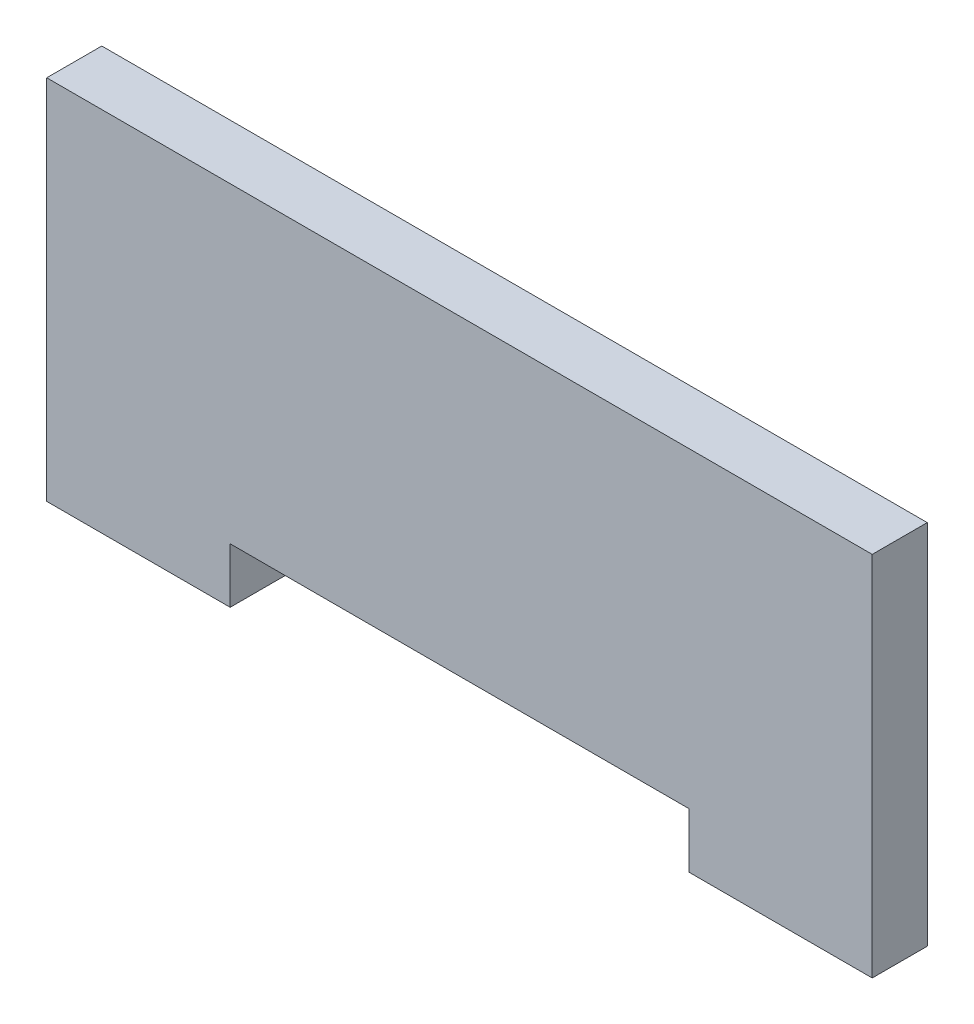
ISO-10303-21;
HEADER;
FILE_DESCRIPTION(('STEP AP214'),'2;1');
FILE_NAME('part.step','',(''),(''),'','','');
FILE_SCHEMA(('AUTOMOTIVE_DESIGN { 1 0 10303 214 1 1 1 1 }'));
ENDSEC;
DATA;
#1=APPLICATION_CONTEXT('core data for automotive mechanical design processes');
#2=APPLICATION_PROTOCOL_DEFINITION('international standard','automotive_design',2000,#1);
#3=PRODUCT_CONTEXT('',#1,'mechanical');
#4=PRODUCT('Part','Part','',(#3));
#5=PRODUCT_RELATED_PRODUCT_CATEGORY('part','',(#4));
#6=PRODUCT_DEFINITION_FORMATION('','',#4);
#7=PRODUCT_DEFINITION_CONTEXT('part definition',#1,'design');
#8=PRODUCT_DEFINITION('design','',#6,#7);
#9=PRODUCT_DEFINITION_SHAPE('','',#8);
#10=(LENGTH_UNIT() NAMED_UNIT(*) SI_UNIT(.MILLI.,.METRE.));
#11=(NAMED_UNIT(*) PLANE_ANGLE_UNIT() SI_UNIT($,.RADIAN.));
#12=(NAMED_UNIT(*) SI_UNIT($,.STERADIAN.) SOLID_ANGLE_UNIT());
#13=UNCERTAINTY_MEASURE_WITH_UNIT(LENGTH_MEASURE(1.E-05),#10,'distance_accuracy_value','');
#14=(GEOMETRIC_REPRESENTATION_CONTEXT(3) GLOBAL_UNCERTAINTY_ASSIGNED_CONTEXT((#13)) GLOBAL_UNIT_ASSIGNED_CONTEXT((#10,
#11,#12)) REPRESENTATION_CONTEXT('',''));
#15=CARTESIAN_POINT('',(0.,0.,0.));
#16=DIRECTION('',(0.,0.,1.));
#17=DIRECTION('',(1.,0.,0.));
#18=AXIS2_PLACEMENT_3D('',#15,#16,#17);
#19=CARTESIAN_POINT('',(0.,0.,3.));
#20=DIRECTION('',(0.,1.,0.));
#21=DIRECTION('',(0.,0.,1.));
#22=AXIS2_PLACEMENT_3D('',#19,#20,#21);
#23=PLANE('',#22);
#24=DIRECTION('',(1.,0.,0.));
#25=VECTOR('',#24,1.);
#26=CARTESIAN_POINT('',(0.,0.,0.));
#27=LINE('',#26,#25);
#28=CARTESIAN_POINT('',(0.,0.,0.));
#29=VERTEX_POINT('',#28);
#30=CARTESIAN_POINT('',(10.,0.,0.));
#31=VERTEX_POINT('',#30);
#32=EDGE_CURVE('E119',#29,#31,#27,.T.);
#33=ORIENTED_EDGE('',*,*,#32,.T.);
#34=DIRECTION('',(0.,0.,1.));
#35=VECTOR('',#34,1.);
#36=CARTESIAN_POINT('',(10.,0.,0.));
#37=LINE('',#36,#35);
#38=CARTESIAN_POINT('',(10.,0.,3.));
#39=VERTEX_POINT('',#38);
#40=EDGE_CURVE('E107',#31,#39,#37,.T.);
#41=ORIENTED_EDGE('',*,*,#40,.T.);
#42=DIRECTION('',(1.,0.,0.));
#43=VECTOR('',#42,1.);
#44=CARTESIAN_POINT('',(0.,0.,3.));
#45=LINE('',#44,#43);
#46=CARTESIAN_POINT('',(0.,0.,3.));
#47=VERTEX_POINT('',#46);
#48=EDGE_CURVE('E85',#47,#39,#45,.T.);
#49=ORIENTED_EDGE('',*,*,#48,.F.);
#50=DIRECTION('',(0.,0.,-1.));
#51=VECTOR('',#50,1.);
#52=CARTESIAN_POINT('',(0.,0.,3.));
#53=LINE('',#52,#51);
#54=EDGE_CURVE('E11',#47,#29,#53,.T.);
#55=ORIENTED_EDGE('',*,*,#54,.T.);
#56=EDGE_LOOP('',(#33,#41,#49,#55));
#57=FACE_BOUND('',#56,.T.);
#58=ADVANCED_FACE('F33',(#57),#23,.F.);
#59=CARTESIAN_POINT('',(0.,0.,3.));
#60=DIRECTION('',(1.,0.,0.));
#61=DIRECTION('',(0.,0.,-1.));
#62=AXIS2_PLACEMENT_3D('',#59,#60,#61);
#63=PLANE('',#62);
#64=DIRECTION('',(0.,-1.,0.));
#65=VECTOR('',#64,1.);
#66=CARTESIAN_POINT('',(0.,0.,0.));
#67=LINE('',#66,#65);
#68=CARTESIAN_POINT('',(0.,20.,0.));
#69=VERTEX_POINT('',#68);
#70=EDGE_CURVE('E130',#69,#29,#67,.T.);
#71=ORIENTED_EDGE('',*,*,#70,.T.);
#72=ORIENTED_EDGE('',*,*,#54,.F.);
#73=DIRECTION('',(0.,-1.,0.));
#74=VECTOR('',#73,1.);
#75=CARTESIAN_POINT('',(0.,0.,3.));
#76=LINE('',#75,#74);
#77=CARTESIAN_POINT('',(0.,20.,3.));
#78=VERTEX_POINT('',#77);
#79=EDGE_CURVE('E135',#78,#47,#76,.T.);
#80=ORIENTED_EDGE('',*,*,#79,.F.);
#81=DIRECTION('',(0.,0.,-1.));
#82=VECTOR('',#81,1.);
#83=CARTESIAN_POINT('',(0.,20.,3.));
#84=LINE('',#83,#82);
#85=EDGE_CURVE('E136',#78,#69,#84,.T.);
#86=ORIENTED_EDGE('',*,*,#85,.T.);
#87=EDGE_LOOP('',(#71,#72,#80,#86));
#88=FACE_BOUND('',#87,.T.);
#89=ADVANCED_FACE('F35',(#88),#63,.F.);
#90=CARTESIAN_POINT('',(35.,0.,3.));
#91=VERTEX_POINT('',#90);
#92=CARTESIAN_POINT('',(45.,0.,3.));
#93=VERTEX_POINT('',#92);
#94=EDGE_CURVE('E161',#91,#93,#45,.T.);
#95=ORIENTED_EDGE('',*,*,#94,.F.);
#96=DIRECTION('',(0.,0.,1.));
#97=VECTOR('',#96,1.);
#98=CARTESIAN_POINT('',(35.,0.,0.));
#99=LINE('',#98,#97);
#100=CARTESIAN_POINT('',(35.,0.,0.));
#101=VERTEX_POINT('',#100);
#102=EDGE_CURVE('E114',#101,#91,#99,.T.);
#103=ORIENTED_EDGE('',*,*,#102,.F.);
#104=CARTESIAN_POINT('',(45.,0.,0.));
#105=VERTEX_POINT('',#104);
#106=EDGE_CURVE('E127',#101,#105,#27,.T.);
#107=ORIENTED_EDGE('',*,*,#106,.T.);
#108=DIRECTION('',(0.,0.,-1.));
#109=VECTOR('',#108,1.);
#110=CARTESIAN_POINT('',(45.,0.,3.));
#111=LINE('',#110,#109);
#112=EDGE_CURVE('E41',#93,#105,#111,.T.);
#113=ORIENTED_EDGE('',*,*,#112,.F.);
#114=EDGE_LOOP('',(#95,#103,#107,#113));
#115=FACE_BOUND('',#114,.T.);
#116=ADVANCED_FACE('F176',(#115),#23,.F.);
#117=CARTESIAN_POINT('',(45.,0.,3.));
#118=DIRECTION('',(-1.,0.,0.));
#119=DIRECTION('',(0.,0.,1.));
#120=AXIS2_PLACEMENT_3D('',#117,#118,#119);
#121=PLANE('',#120);
#122=DIRECTION('',(0.,1.,0.));
#123=VECTOR('',#122,1.);
#124=CARTESIAN_POINT('',(45.,0.,0.));
#125=LINE('',#124,#123);
#126=CARTESIAN_POINT('',(45.,20.,0.));
#127=VERTEX_POINT('',#126);
#128=EDGE_CURVE('E126',#105,#127,#125,.T.);
#129=ORIENTED_EDGE('',*,*,#128,.T.);
#130=DIRECTION('',(0.,0.,-1.));
#131=VECTOR('',#130,1.);
#132=CARTESIAN_POINT('',(45.,20.,3.));
#133=LINE('',#132,#131);
#134=CARTESIAN_POINT('',(45.,20.,3.));
#135=VERTEX_POINT('',#134);
#136=EDGE_CURVE('E138',#135,#127,#133,.T.);
#137=ORIENTED_EDGE('',*,*,#136,.F.);
#138=DIRECTION('',(0.,1.,0.));
#139=VECTOR('',#138,1.);
#140=CARTESIAN_POINT('',(45.,0.,3.));
#141=LINE('',#140,#139);
#142=EDGE_CURVE('E146',#93,#135,#141,.T.);
#143=ORIENTED_EDGE('',*,*,#142,.F.);
#144=ORIENTED_EDGE('',*,*,#112,.T.);
#145=EDGE_LOOP('',(#129,#137,#143,#144));
#146=FACE_BOUND('',#145,.T.);
#147=ADVANCED_FACE('F144',(#146),#121,.F.);
#148=CARTESIAN_POINT('',(0.,20.,3.));
#149=DIRECTION('',(0.,-1.,0.));
#150=DIRECTION('',(0.,0.,-1.));
#151=AXIS2_PLACEMENT_3D('',#148,#149,#150);
#152=PLANE('',#151);
#153=DIRECTION('',(-1.,0.,0.));
#154=VECTOR('',#153,1.);
#155=CARTESIAN_POINT('',(0.,20.,0.));
#156=LINE('',#155,#154);
#157=EDGE_CURVE('E78',#127,#69,#156,.T.);
#158=ORIENTED_EDGE('',*,*,#157,.T.);
#159=ORIENTED_EDGE('',*,*,#85,.F.);
#160=DIRECTION('',(-1.,0.,0.));
#161=VECTOR('',#160,1.);
#162=CARTESIAN_POINT('',(0.,20.,3.));
#163=LINE('',#162,#161);
#164=EDGE_CURVE('E57',#135,#78,#163,.T.);
#165=ORIENTED_EDGE('',*,*,#164,.F.);
#166=ORIENTED_EDGE('',*,*,#136,.T.);
#167=EDGE_LOOP('',(#158,#159,#165,#166));
#168=FACE_BOUND('',#167,.T.);
#169=ADVANCED_FACE('F165',(#168),#152,.F.);
#170=CARTESIAN_POINT('',(0.,0.,3.));
#171=DIRECTION('',(0.,0.,-1.));
#172=DIRECTION('',(-1.,0.,0.));
#173=AXIS2_PLACEMENT_3D('',#170,#171,#172);
#174=PLANE('',#173);
#175=ORIENTED_EDGE('',*,*,#48,.T.);
#176=DIRECTION('',(0.,-1.,0.));
#177=VECTOR('',#176,1.);
#178=CARTESIAN_POINT('',(10.,0.,3.));
#179=LINE('',#178,#177);
#180=CARTESIAN_POINT('',(10.,3.,3.));
#181=VERTEX_POINT('',#180);
#182=EDGE_CURVE('E112',#181,#39,#179,.T.);
#183=ORIENTED_EDGE('',*,*,#182,.F.);
#184=DIRECTION('',(-1.,0.,0.));
#185=VECTOR('',#184,1.);
#186=CARTESIAN_POINT('',(10.,3.,3.));
#187=LINE('',#186,#185);
#188=CARTESIAN_POINT('',(35.,3.,3.));
#189=VERTEX_POINT('',#188);
#190=EDGE_CURVE('E122',#189,#181,#187,.T.);
#191=ORIENTED_EDGE('',*,*,#190,.F.);
#192=DIRECTION('',(0.,1.,0.));
#193=VECTOR('',#192,1.);
#194=CARTESIAN_POINT('',(35.,0.,3.));
#195=LINE('',#194,#193);
#196=EDGE_CURVE('E168',#91,#189,#195,.T.);
#197=ORIENTED_EDGE('',*,*,#196,.F.);
#198=ORIENTED_EDGE('',*,*,#94,.T.);
#199=ORIENTED_EDGE('',*,*,#142,.T.);
#200=ORIENTED_EDGE('',*,*,#164,.T.);
#201=ORIENTED_EDGE('',*,*,#79,.T.);
#202=EDGE_LOOP('',(#175,#183,#191,#197,#198,#199,#200,#201));
#203=FACE_BOUND('',#202,.T.);
#204=ADVANCED_FACE('F163',(#203),#174,.F.);
#205=CARTESIAN_POINT('',(0.,0.,0.));
#206=DIRECTION('',(0.,0.,-1.));
#207=DIRECTION('',(-1.,0.,0.));
#208=AXIS2_PLACEMENT_3D('',#205,#206,#207);
#209=PLANE('',#208);
#210=DIRECTION('',(0.,-1.,0.));
#211=VECTOR('',#210,1.);
#212=CARTESIAN_POINT('',(10.,0.,0.));
#213=LINE('',#212,#211);
#214=CARTESIAN_POINT('',(10.,3.,0.));
#215=VERTEX_POINT('',#214);
#216=EDGE_CURVE('E110',#215,#31,#213,.T.);
#217=ORIENTED_EDGE('',*,*,#216,.T.);
#218=ORIENTED_EDGE('',*,*,#32,.F.);
#219=ORIENTED_EDGE('',*,*,#70,.F.);
#220=ORIENTED_EDGE('',*,*,#157,.F.);
#221=ORIENTED_EDGE('',*,*,#128,.F.);
#222=ORIENTED_EDGE('',*,*,#106,.F.);
#223=DIRECTION('',(0.,1.,0.));
#224=VECTOR('',#223,1.);
#225=CARTESIAN_POINT('',(35.,0.,0.));
#226=LINE('',#225,#224);
#227=CARTESIAN_POINT('',(35.,3.,0.));
#228=VERTEX_POINT('',#227);
#229=EDGE_CURVE('E121',#101,#228,#226,.T.);
#230=ORIENTED_EDGE('',*,*,#229,.T.);
#231=DIRECTION('',(-1.,0.,0.));
#232=VECTOR('',#231,1.);
#233=CARTESIAN_POINT('',(10.,3.,0.));
#234=LINE('',#233,#232);
#235=EDGE_CURVE('E48',#228,#215,#234,.T.);
#236=ORIENTED_EDGE('',*,*,#235,.T.);
#237=EDGE_LOOP('',(#217,#218,#219,#220,#221,#222,#230,#236));
#238=FACE_BOUND('',#237,.T.);
#239=ADVANCED_FACE('F117',(#238),#209,.T.);
#240=CARTESIAN_POINT('',(10.,0.,0.));
#241=DIRECTION('',(-1.,0.,0.));
#242=DIRECTION('',(0.,0.,1.));
#243=AXIS2_PLACEMENT_3D('',#240,#241,#242);
#244=PLANE('',#243);
#245=ORIENTED_EDGE('',*,*,#182,.T.);
#246=ORIENTED_EDGE('',*,*,#40,.F.);
#247=ORIENTED_EDGE('',*,*,#216,.F.);
#248=DIRECTION('',(0.,0.,1.));
#249=VECTOR('',#248,1.);
#250=CARTESIAN_POINT('',(10.,3.,0.));
#251=LINE('',#250,#249);
#252=EDGE_CURVE('E151',#215,#181,#251,.T.);
#253=ORIENTED_EDGE('',*,*,#252,.T.);
#254=EDGE_LOOP('',(#245,#246,#247,#253));
#255=FACE_BOUND('',#254,.T.);
#256=ADVANCED_FACE('F109',(#255),#244,.F.);
#257=CARTESIAN_POINT('',(10.,3.,0.));
#258=DIRECTION('',(0.,1.,0.));
#259=DIRECTION('',(0.,0.,1.));
#260=AXIS2_PLACEMENT_3D('',#257,#258,#259);
#261=PLANE('',#260);
#262=ORIENTED_EDGE('',*,*,#190,.T.);
#263=ORIENTED_EDGE('',*,*,#252,.F.);
#264=ORIENTED_EDGE('',*,*,#235,.F.);
#265=DIRECTION('',(0.,0.,1.));
#266=VECTOR('',#265,1.);
#267=CARTESIAN_POINT('',(35.,3.,0.));
#268=LINE('',#267,#266);
#269=EDGE_CURVE('E152',#228,#189,#268,.T.);
#270=ORIENTED_EDGE('',*,*,#269,.T.);
#271=EDGE_LOOP('',(#262,#263,#264,#270));
#272=FACE_BOUND('',#271,.T.);
#273=ADVANCED_FACE('F225',(#272),#261,.F.);
#274=CARTESIAN_POINT('',(35.,0.,0.));
#275=DIRECTION('',(1.,0.,0.));
#276=DIRECTION('',(0.,0.,-1.));
#277=AXIS2_PLACEMENT_3D('',#274,#275,#276);
#278=PLANE('',#277);
#279=ORIENTED_EDGE('',*,*,#196,.T.);
#280=ORIENTED_EDGE('',*,*,#269,.F.);
#281=ORIENTED_EDGE('',*,*,#229,.F.);
#282=ORIENTED_EDGE('',*,*,#102,.T.);
#283=EDGE_LOOP('',(#279,#280,#281,#282));
#284=FACE_BOUND('',#283,.T.);
#285=ADVANCED_FACE('F175',(#284),#278,.F.);
#286=CLOSED_SHELL('',(#58,#89,#116,#147,#169,#204,#239,#256,#273,#285));
#287=MANIFOLD_SOLID_BREP('B2',#286);
#288=ADVANCED_BREP_SHAPE_REPRESENTATION('',(#18,#287),#14);
#289=SHAPE_DEFINITION_REPRESENTATION(#9,#288);
ENDSEC;
END-ISO-10303-21;
